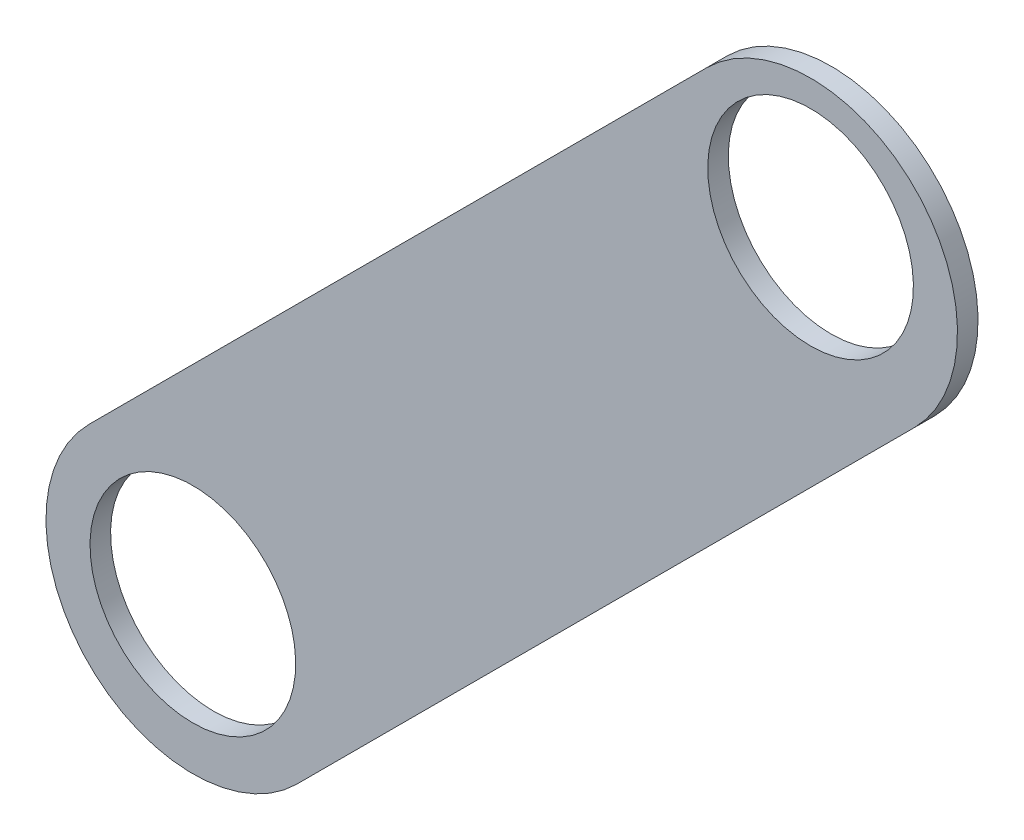
ISO-10303-21;
HEADER;
FILE_DESCRIPTION(('STEP AP214'),'2;1');
FILE_NAME('part.step','',(''),(''),'','','');
FILE_SCHEMA(('AUTOMOTIVE_DESIGN { 1 0 10303 214 1 1 1 1 }'));
ENDSEC;
DATA;
#1=APPLICATION_CONTEXT('core data for automotive mechanical design processes');
#2=APPLICATION_PROTOCOL_DEFINITION('international standard','automotive_design',2000,#1);
#3=PRODUCT_CONTEXT('',#1,'mechanical');
#4=PRODUCT('Part','Part','',(#3));
#5=PRODUCT_RELATED_PRODUCT_CATEGORY('part','',(#4));
#6=PRODUCT_DEFINITION_FORMATION('','',#4);
#7=PRODUCT_DEFINITION_CONTEXT('part definition',#1,'design');
#8=PRODUCT_DEFINITION('design','',#6,#7);
#9=PRODUCT_DEFINITION_SHAPE('','',#8);
#10=(LENGTH_UNIT() NAMED_UNIT(*) SI_UNIT(.MILLI.,.METRE.));
#11=(NAMED_UNIT(*) PLANE_ANGLE_UNIT() SI_UNIT($,.RADIAN.));
#12=(NAMED_UNIT(*) SI_UNIT($,.STERADIAN.) SOLID_ANGLE_UNIT());
#13=UNCERTAINTY_MEASURE_WITH_UNIT(LENGTH_MEASURE(1.E-05),#10,'distance_accuracy_value','');
#14=(GEOMETRIC_REPRESENTATION_CONTEXT(3) GLOBAL_UNCERTAINTY_ASSIGNED_CONTEXT((#13)) GLOBAL_UNIT_ASSIGNED_CONTEXT((#10,
#11,#12)) REPRESENTATION_CONTEXT('',''));
#15=CARTESIAN_POINT('',(0.,0.,0.));
#16=DIRECTION('',(0.,0.,1.));
#17=DIRECTION('',(1.,0.,0.));
#18=AXIS2_PLACEMENT_3D('',#15,#16,#17);
#19=CARTESIAN_POINT('',(133.95,-71.31,-0.045));
#20=DIRECTION('',(0.,0.,-1.));
#21=DIRECTION('',(0.,-1.,0.));
#22=AXIS2_PLACEMENT_3D('',#19,#20,#21);
#23=CYLINDRICAL_SURFACE('',#22,0.175);
#24=CARTESIAN_POINT('',(133.95,-71.31,-0.035));
#25=DIRECTION('',(0.,0.,-1.));
#26=DIRECTION('',(0.,-1.,0.));
#27=AXIS2_PLACEMENT_3D('',#24,#25,#26);
#28=CIRCLE('',#27,0.175);
#29=CARTESIAN_POINT('',(133.95,-71.485,-0.035));
#30=VERTEX_POINT('',#29);
#31=EDGE_CURVE('E132',#30,#30,#28,.T.);
#32=ORIENTED_EDGE('',*,*,#31,.T.);
#33=DIRECTION('',(0.,0.,1.));
#34=VECTOR('',#33,1.);
#35=CARTESIAN_POINT('',(133.95,-71.485,-0.045));
#36=LINE('',#35,#34);
#37=CARTESIAN_POINT('',(133.95,-71.485,0.));
#38=VERTEX_POINT('',#37);
#39=EDGE_CURVE('E11',#30,#38,#36,.T.);
#40=ORIENTED_EDGE('',*,*,#39,.T.);
#41=CARTESIAN_POINT('',(133.95,-71.31,0.));
#42=DIRECTION('',(0.,0.,-1.));
#43=DIRECTION('',(0.,-1.,0.));
#44=AXIS2_PLACEMENT_3D('',#41,#42,#43);
#45=CIRCLE('',#44,0.175);
#46=EDGE_CURVE('E138',#38,#38,#45,.T.);
#47=ORIENTED_EDGE('',*,*,#46,.F.);
#48=ORIENTED_EDGE('',*,*,#39,.F.);
#49=EDGE_LOOP('',(#32,#40,#47,#48));
#50=FACE_BOUND('',#49,.T.);
#51=ADVANCED_FACE('F17',(#50),#23,.F.);
#52=CARTESIAN_POINT('',(132.898812,-72.391188,-0.045));
#53=DIRECTION('',(0.,0.,-1.));
#54=DIRECTION('',(-1.624097681738E-13,-1.,0.));
#55=AXIS2_PLACEMENT_3D('',#52,#53,#54);
#56=CYLINDRICAL_SURFACE('',#55,0.175);
#57=CARTESIAN_POINT('',(132.898812,-72.391188,-0.035));
#58=DIRECTION('',(0.,0.,-1.));
#59=DIRECTION('',(-1.624097681738E-13,-1.,0.));
#60=AXIS2_PLACEMENT_3D('',#57,#58,#59);
#61=CIRCLE('',#60,0.175);
#62=CARTESIAN_POINT('',(132.898812,-72.566188,-0.035));
#63=VERTEX_POINT('',#62);
#64=EDGE_CURVE('E136',#63,#63,#61,.T.);
#65=ORIENTED_EDGE('',*,*,#64,.T.);
#66=DIRECTION('',(0.,0.,1.));
#67=VECTOR('',#66,1.);
#68=CARTESIAN_POINT('',(132.898812,-72.566188,-0.045));
#69=LINE('',#68,#67);
#70=CARTESIAN_POINT('',(132.898812,-72.566188,0.));
#71=VERTEX_POINT('',#70);
#72=EDGE_CURVE('E25',#63,#71,#69,.T.);
#73=ORIENTED_EDGE('',*,*,#72,.T.);
#74=CARTESIAN_POINT('',(132.898812,-72.391188,0.));
#75=DIRECTION('',(0.,0.,-1.));
#76=DIRECTION('',(-1.624097681738E-13,-1.,0.));
#77=AXIS2_PLACEMENT_3D('',#74,#75,#76);
#78=CIRCLE('',#77,0.175);
#79=EDGE_CURVE('E131',#71,#71,#78,.T.);
#80=ORIENTED_EDGE('',*,*,#79,.F.);
#81=ORIENTED_EDGE('',*,*,#72,.F.);
#82=EDGE_LOOP('',(#65,#73,#80,#81));
#83=FACE_BOUND('',#82,.T.);
#84=ADVANCED_FACE('F269',(#83),#56,.F.);
#85=CARTESIAN_POINT('',(133.075588,-72.567964,-0.035));
#86=DIRECTION('',(-0.707106781186548,0.707106781186548,0.));
#87=DIRECTION('',(0.,0.,1.));
#88=AXIS2_PLACEMENT_3D('',#85,#86,#87);
#89=PLANE('',#88);
#90=DIRECTION('',(0.707106781186548,0.707106781186548,0.));
#91=VECTOR('',#90,1.);
#92=CARTESIAN_POINT('',(133.075588,-72.567964,-0.035));
#93=LINE('',#92,#91);
#94=CARTESIAN_POINT('',(133.075588,-72.567964,-0.035));
#95=VERTEX_POINT('',#94);
#96=CARTESIAN_POINT('',(134.126776,-71.516776,-0.035));
#97=VERTEX_POINT('',#96);
#98=EDGE_CURVE('E133',#95,#97,#93,.T.);
#99=ORIENTED_EDGE('',*,*,#98,.T.);
#100=DIRECTION('',(0.,0.,1.));
#101=VECTOR('',#100,1.);
#102=CARTESIAN_POINT('',(134.126776,-71.516776,-0.035));
#103=LINE('',#102,#101);
#104=CARTESIAN_POINT('',(134.126776,-71.516776,0.));
#105=VERTEX_POINT('',#104);
#106=EDGE_CURVE('E101',#97,#105,#103,.T.);
#107=ORIENTED_EDGE('',*,*,#106,.T.);
#108=DIRECTION('',(0.707106781186548,0.707106781186548,0.));
#109=VECTOR('',#108,1.);
#110=CARTESIAN_POINT('',(133.075588,-72.567964,0.));
#111=LINE('',#110,#109);
#112=CARTESIAN_POINT('',(133.075588,-72.567964,0.));
#113=VERTEX_POINT('',#112);
#114=EDGE_CURVE('E68',#113,#105,#111,.T.);
#115=ORIENTED_EDGE('',*,*,#114,.F.);
#116=DIRECTION('',(0.,0.,1.));
#117=VECTOR('',#116,1.);
#118=CARTESIAN_POINT('',(133.075588,-72.567964,-0.035));
#119=LINE('',#118,#117);
#120=EDGE_CURVE('E145',#95,#113,#119,.T.);
#121=ORIENTED_EDGE('',*,*,#120,.F.);
#122=EDGE_LOOP('',(#99,#107,#115,#121));
#123=FACE_BOUND('',#122,.T.);
#124=ADVANCED_FACE('F259',(#123),#89,.F.);
#125=CARTESIAN_POINT('',(133.773223,-71.163223,0.));
#126=DIRECTION('',(0.,0.,1.));
#127=DIRECTION('',(1.,0.,0.));
#128=AXIS2_PLACEMENT_3D('',#125,#126,#127);
#129=PLANE('',#128);
#130=ORIENTED_EDGE('',*,*,#46,.T.);
#131=EDGE_LOOP('',(#130));
#132=FACE_BOUND('',#131,.T.);
#133=ORIENTED_EDGE('',*,*,#79,.T.);
#134=EDGE_LOOP('',(#133));
#135=FACE_BOUND('',#134,.T.);
#136=DIRECTION('',(-0.707106781186548,-0.707106781186548,0.));
#137=VECTOR('',#136,1.);
#138=CARTESIAN_POINT('',(133.773223,-71.163223,0.));
#139=LINE('',#138,#137);
#140=CARTESIAN_POINT('',(133.773223,-71.163223,0.));
#141=VERTEX_POINT('',#140);
#142=CARTESIAN_POINT('',(132.722035,-72.214411,0.));
#143=VERTEX_POINT('',#142);
#144=EDGE_CURVE('E113',#141,#143,#139,.T.);
#145=ORIENTED_EDGE('',*,*,#144,.T.);
#146=CARTESIAN_POINT('',(132.8988115,-72.3911875,0.));
#147=DIRECTION('',(0.,0.,1.));
#148=DIRECTION('',(-0.707106781186548,0.707106781186548,0.));
#149=AXIS2_PLACEMENT_3D('',#146,#147,#148);
#150=CIRCLE('',#149,0.249999723809);
#151=EDGE_CURVE('E137',#143,#113,#150,.T.);
#152=ORIENTED_EDGE('',*,*,#151,.T.);
#153=ORIENTED_EDGE('',*,*,#114,.T.);
#154=CARTESIAN_POINT('',(133.9499995,-71.3399995,0.));
#155=DIRECTION('',(0.,0.,1.));
#156=DIRECTION('',(0.707106781187048,-0.707106781186048,0.));
#157=AXIS2_PLACEMENT_3D('',#154,#155,#156);
#158=CIRCLE('',#157,0.249999723809);
#159=EDGE_CURVE('E105',#105,#141,#158,.T.);
#160=ORIENTED_EDGE('',*,*,#159,.T.);
#161=EDGE_LOOP('',(#145,#152,#153,#160));
#162=FACE_BOUND('',#161,.T.);
#163=ADVANCED_FACE('F249',(#132,#135,#162),#129,.T.);
#164=CARTESIAN_POINT('',(133.773223,-71.163223,-0.035));
#165=DIRECTION('',(0.,0.,1.));
#166=DIRECTION('',(1.,0.,0.));
#167=AXIS2_PLACEMENT_3D('',#164,#165,#166);
#168=PLANE('',#167);
#169=ORIENTED_EDGE('',*,*,#31,.F.);
#170=EDGE_LOOP('',(#169));
#171=FACE_BOUND('',#170,.T.);
#172=ORIENTED_EDGE('',*,*,#64,.F.);
#173=EDGE_LOOP('',(#172));
#174=FACE_BOUND('',#173,.T.);
#175=CARTESIAN_POINT('',(133.9499995,-71.3399995,-0.035));
#176=DIRECTION('',(0.,0.,1.));
#177=DIRECTION('',(0.707106781187048,-0.707106781186048,0.));
#178=AXIS2_PLACEMENT_3D('',#175,#176,#177);
#179=CIRCLE('',#178,0.249999723809);
#180=CARTESIAN_POINT('',(133.773223,-71.163223,-0.035));
#181=VERTEX_POINT('',#180);
#182=EDGE_CURVE('E95',#97,#181,#179,.T.);
#183=ORIENTED_EDGE('',*,*,#182,.F.);
#184=ORIENTED_EDGE('',*,*,#98,.F.);
#185=CARTESIAN_POINT('',(132.8988115,-72.3911875,-0.035));
#186=DIRECTION('',(0.,0.,1.));
#187=DIRECTION('',(-0.707106781186548,0.707106781186548,0.));
#188=AXIS2_PLACEMENT_3D('',#185,#186,#187);
#189=CIRCLE('',#188,0.249999723809);
#190=CARTESIAN_POINT('',(132.722035,-72.214411,-0.035));
#191=VERTEX_POINT('',#190);
#192=EDGE_CURVE('E118',#191,#95,#189,.T.);
#193=ORIENTED_EDGE('',*,*,#192,.F.);
#194=DIRECTION('',(-0.707106781186548,-0.707106781186548,0.));
#195=VECTOR('',#194,1.);
#196=CARTESIAN_POINT('',(133.773223,-71.163223,-0.035));
#197=LINE('',#196,#195);
#198=EDGE_CURVE('E111',#181,#191,#197,.T.);
#199=ORIENTED_EDGE('',*,*,#198,.F.);
#200=EDGE_LOOP('',(#183,#184,#193,#199));
#201=FACE_BOUND('',#200,.T.);
#202=ADVANCED_FACE('F116',(#171,#174,#201),#168,.F.);
#203=CARTESIAN_POINT('',(132.8988115,-72.3911875,-0.035));
#204=DIRECTION('',(0.,0.,-1.));
#205=DIRECTION('',(-0.707106781186548,0.707106781186548,0.));
#206=AXIS2_PLACEMENT_3D('',#203,#204,#205);
#207=CYLINDRICAL_SURFACE('',#206,0.249999723809);
#208=ORIENTED_EDGE('',*,*,#192,.T.);
#209=ORIENTED_EDGE('',*,*,#120,.T.);
#210=ORIENTED_EDGE('',*,*,#151,.F.);
#211=DIRECTION('',(0.,0.,1.));
#212=VECTOR('',#211,1.);
#213=CARTESIAN_POINT('',(132.722035,-72.214411,-0.035));
#214=LINE('',#213,#212);
#215=EDGE_CURVE('E121',#191,#143,#214,.T.);
#216=ORIENTED_EDGE('',*,*,#215,.F.);
#217=EDGE_LOOP('',(#208,#209,#210,#216));
#218=FACE_BOUND('',#217,.T.);
#219=ADVANCED_FACE('F231',(#218),#207,.T.);
#220=CARTESIAN_POINT('',(133.9499995,-71.3399995,-0.035));
#221=DIRECTION('',(0.,0.,-1.));
#222=DIRECTION('',(0.707106781187048,-0.707106781186048,0.));
#223=AXIS2_PLACEMENT_3D('',#220,#221,#222);
#224=CYLINDRICAL_SURFACE('',#223,0.249999723809);
#225=ORIENTED_EDGE('',*,*,#182,.T.);
#226=DIRECTION('',(0.,0.,1.));
#227=VECTOR('',#226,1.);
#228=CARTESIAN_POINT('',(133.773223,-71.163223,-0.035));
#229=LINE('',#228,#227);
#230=EDGE_CURVE('E99',#181,#141,#229,.T.);
#231=ORIENTED_EDGE('',*,*,#230,.T.);
#232=ORIENTED_EDGE('',*,*,#159,.F.);
#233=ORIENTED_EDGE('',*,*,#106,.F.);
#234=EDGE_LOOP('',(#225,#231,#232,#233));
#235=FACE_BOUND('',#234,.T.);
#236=ADVANCED_FACE('F97',(#235),#224,.T.);
#237=CARTESIAN_POINT('',(133.773223,-71.163223,-0.035));
#238=DIRECTION('',(0.707106781186548,-0.707106781186548,0.));
#239=DIRECTION('',(0.,0.,-1.));
#240=AXIS2_PLACEMENT_3D('',#237,#238,#239);
#241=PLANE('',#240);
#242=ORIENTED_EDGE('',*,*,#198,.T.);
#243=ORIENTED_EDGE('',*,*,#215,.T.);
#244=ORIENTED_EDGE('',*,*,#144,.F.);
#245=ORIENTED_EDGE('',*,*,#230,.F.);
#246=EDGE_LOOP('',(#242,#243,#244,#245));
#247=FACE_BOUND('',#246,.T.);
#248=ADVANCED_FACE('F109',(#247),#241,.F.);
#249=CLOSED_SHELL('',(#51,#84,#124,#163,#202,#219,#236,#248));
#250=MANIFOLD_SOLID_BREP('B1',#249);
#251=ADVANCED_BREP_SHAPE_REPRESENTATION('',(#18,#250),#14);
#252=SHAPE_DEFINITION_REPRESENTATION(#9,#251);
ENDSEC;
END-ISO-10303-21;
